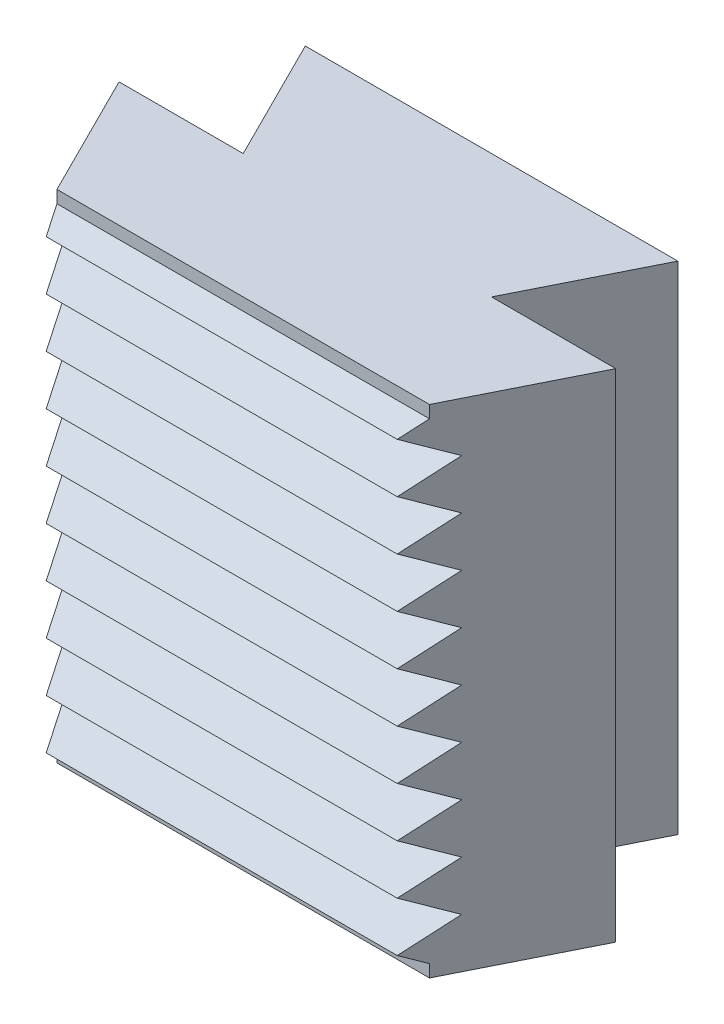
ISO-10303-21;
HEADER;
FILE_DESCRIPTION(('STEP AP214'),'2;1');
FILE_NAME('part.step','',(''),(''),'','','');
FILE_SCHEMA(('AUTOMOTIVE_DESIGN { 1 0 10303 214 1 1 1 1 }'));
ENDSEC;
DATA;
#1=APPLICATION_CONTEXT('core data for automotive mechanical design processes');
#2=APPLICATION_PROTOCOL_DEFINITION('international standard','automotive_design',2000,#1);
#3=PRODUCT_CONTEXT('',#1,'mechanical');
#4=PRODUCT('Part','Part','',(#3));
#5=PRODUCT_RELATED_PRODUCT_CATEGORY('part','',(#4));
#6=PRODUCT_DEFINITION_FORMATION('','',#4);
#7=PRODUCT_DEFINITION_CONTEXT('part definition',#1,'design');
#8=PRODUCT_DEFINITION('design','',#6,#7);
#9=PRODUCT_DEFINITION_SHAPE('','',#8);
#10=(LENGTH_UNIT() NAMED_UNIT(*) SI_UNIT(.MILLI.,.METRE.));
#11=(NAMED_UNIT(*) PLANE_ANGLE_UNIT() SI_UNIT($,.RADIAN.));
#12=(NAMED_UNIT(*) SI_UNIT($,.STERADIAN.) SOLID_ANGLE_UNIT());
#13=UNCERTAINTY_MEASURE_WITH_UNIT(LENGTH_MEASURE(1.E-05),#10,'distance_accuracy_value','');
#14=(GEOMETRIC_REPRESENTATION_CONTEXT(3) GLOBAL_UNCERTAINTY_ASSIGNED_CONTEXT((#13)) GLOBAL_UNIT_ASSIGNED_CONTEXT((#10,
#11,#12)) REPRESENTATION_CONTEXT('',''));
#15=CARTESIAN_POINT('',(0.,0.,0.));
#16=DIRECTION('',(0.,0.,1.));
#17=DIRECTION('',(1.,0.,0.));
#18=AXIS2_PLACEMENT_3D('',#15,#16,#17);
#19=CARTESIAN_POINT('',(-3.75,-5.,0.));
#20=DIRECTION('',(0.,0.,1.));
#21=DIRECTION('',(1.,0.,0.));
#22=AXIS2_PLACEMENT_3D('',#19,#20,#21);
#23=PLANE('',#22);
#24=DIRECTION('',(0.,1.,0.));
#25=VECTOR('',#24,1.);
#26=CARTESIAN_POINT('',(3.75,-5.,0.));
#27=LINE('',#26,#25);
#28=CARTESIAN_POINT('',(3.75,-5.,0.));
#29=VERTEX_POINT('',#28);
#30=CARTESIAN_POINT('',(3.75,-4.74999999999995,0.));
#31=VERTEX_POINT('',#30);
#32=EDGE_CURVE('E503',#29,#31,#27,.T.);
#33=ORIENTED_EDGE('',*,*,#32,.T.);
#34=DIRECTION('',(-1.,0.,0.));
#35=VECTOR('',#34,1.);
#36=CARTESIAN_POINT('',(-3.75,-4.74999999999995,0.));
#37=LINE('',#36,#35);
#38=CARTESIAN_POINT('',(-3.75,-4.74999999999995,0.));
#39=VERTEX_POINT('',#38);
#40=EDGE_CURVE('E276',#31,#39,#37,.T.);
#41=ORIENTED_EDGE('',*,*,#40,.T.);
#42=DIRECTION('',(0.,1.,0.));
#43=VECTOR('',#42,1.);
#44=CARTESIAN_POINT('',(-3.75,-5.,0.));
#45=LINE('',#44,#43);
#46=CARTESIAN_POINT('',(-3.75,-5.,0.));
#47=VERTEX_POINT('',#46);
#48=EDGE_CURVE('E507',#47,#39,#45,.T.);
#49=ORIENTED_EDGE('',*,*,#48,.F.);
#50=DIRECTION('',(1.,0.,0.));
#51=VECTOR('',#50,1.);
#52=CARTESIAN_POINT('',(-3.75,-5.,0.));
#53=LINE('',#52,#51);
#54=EDGE_CURVE('E457',#47,#29,#53,.T.);
#55=ORIENTED_EDGE('',*,*,#54,.T.);
#56=EDGE_LOOP('',(#33,#41,#49,#55));
#57=FACE_BOUND('',#56,.T.);
#58=ADVANCED_FACE('F41',(#57),#23,.T.);
#59=CARTESIAN_POINT('',(-3.75,4.75,0.));
#60=VERTEX_POINT('',#59);
#61=CARTESIAN_POINT('',(-3.75,5.,0.));
#62=VERTEX_POINT('',#61);
#63=EDGE_CURVE('E485',#60,#62,#45,.T.);
#64=ORIENTED_EDGE('',*,*,#63,.F.);
#65=DIRECTION('',(1.,0.,0.));
#66=VECTOR('',#65,1.);
#67=CARTESIAN_POINT('',(-3.75,4.75,0.));
#68=LINE('',#67,#66);
#69=CARTESIAN_POINT('',(3.75,4.75,0.));
#70=VERTEX_POINT('',#69);
#71=EDGE_CURVE('E11',#60,#70,#68,.T.);
#72=ORIENTED_EDGE('',*,*,#71,.T.);
#73=CARTESIAN_POINT('',(3.75,5.,0.));
#74=VERTEX_POINT('',#73);
#75=EDGE_CURVE('E506',#70,#74,#27,.T.);
#76=ORIENTED_EDGE('',*,*,#75,.T.);
#77=DIRECTION('',(1.,0.,0.));
#78=VECTOR('',#77,1.);
#79=CARTESIAN_POINT('',(-3.75,5.,0.));
#80=LINE('',#79,#78);
#81=EDGE_CURVE('E425',#62,#74,#80,.T.);
#82=ORIENTED_EDGE('',*,*,#81,.F.);
#83=EDGE_LOOP('',(#64,#72,#76,#82));
#84=FACE_BOUND('',#83,.T.);
#85=ADVANCED_FACE('F515',(#84),#23,.T.);
#86=CARTESIAN_POINT('',(-5.,-5.,-2.5));
#87=DIRECTION('',(-0.894427190999915,0.,0.447213595499959));
#88=DIRECTION('',(0.447213595499959,0.,0.894427190999915));
#89=AXIS2_PLACEMENT_3D('',#86,#87,#88);
#90=PLANE('',#89);
#91=DIRECTION('',(0.397359707119514,-0.458831467741123,0.794719414239026));
#92=VECTOR('',#91,1.);
#93=CARTESIAN_POINT('',(-3.9985159787279,4.03696153443295,-0.497031957455802));
#94=LINE('',#93,#92);
#95=CARTESIAN_POINT('',(-3.96650635094611,4.00000000000001,-0.433012701892223));
#96=VERTEX_POINT('',#95);
#97=CARTESIAN_POINT('',(-3.53349364905389,3.5,0.433012701892209));
#98=VERTEX_POINT('',#97);
#99=EDGE_CURVE('E384',#96,#98,#94,.T.);
#100=ORIENTED_EDGE('',*,*,#99,.F.);
#101=DIRECTION('',(-0.397359707119514,-0.458831467741124,-0.794719414239026));
#102=VECTOR('',#101,1.);
#103=CARTESIAN_POINT('',(-3.72503427226965,4.27882793925126,0.0499314554606941));
#104=LINE('',#103,#102);
#105=CARTESIAN_POINT('',(-3.53349364905389,4.5,0.43301270189222));
#106=VERTEX_POINT('',#105);
#107=EDGE_CURVE('E400',#106,#96,#104,.T.);
#108=ORIENTED_EDGE('',*,*,#107,.F.);
#109=DIRECTION('',(0.397359707119514,-0.458831467741123,0.794719414239026));
#110=VECTOR('',#109,1.);
#111=CARTESIAN_POINT('',(-3.9985159787279,5.03696153443295,-0.497031957455793));
#112=LINE('',#111,#110);
#113=EDGE_CURVE('E65',#60,#106,#112,.T.);
#114=ORIENTED_EDGE('',*,*,#113,.F.);
#115=ORIENTED_EDGE('',*,*,#63,.T.);
#116=DIRECTION('',(0.447213595499959,0.,0.894427190999915));
#117=VECTOR('',#116,1.);
#118=CARTESIAN_POINT('',(-5.,5.,-2.5));
#119=LINE('',#118,#117);
#120=CARTESIAN_POINT('',(-5.,5.,-2.5));
#121=VERTEX_POINT('',#120);
#122=EDGE_CURVE('E415',#121,#62,#119,.T.);
#123=ORIENTED_EDGE('',*,*,#122,.F.);
#124=DIRECTION('',(0.,1.,0.));
#125=VECTOR('',#124,1.);
#126=CARTESIAN_POINT('',(-5.,-5.,-2.5));
#127=LINE('',#126,#125);
#128=CARTESIAN_POINT('',(-5.,-5.,-2.5));
#129=VERTEX_POINT('',#128);
#130=EDGE_CURVE('E50',#129,#121,#127,.T.);
#131=ORIENTED_EDGE('',*,*,#130,.F.);
#132=DIRECTION('',(0.447213595499959,0.,0.894427190999915));
#133=VECTOR('',#132,1.);
#134=CARTESIAN_POINT('',(-5.,-5.,-2.5));
#135=LINE('',#134,#133);
#136=EDGE_CURVE('E453',#129,#47,#135,.T.);
#137=ORIENTED_EDGE('',*,*,#136,.T.);
#138=ORIENTED_EDGE('',*,*,#48,.T.);
#139=DIRECTION('',(-0.397359707119514,-0.458831467741124,-0.794719414239026));
#140=VECTOR('',#139,1.);
#141=CARTESIAN_POINT('',(-3.72503427226969,-4.72117206074873,0.0499314554606147));
#142=LINE('',#141,#140);
#143=CARTESIAN_POINT('',(-3.53349364905394,-4.5,0.433012701892126));
#144=VERTEX_POINT('',#143);
#145=EDGE_CURVE('E250',#144,#39,#142,.T.);
#146=ORIENTED_EDGE('',*,*,#145,.F.);
#147=DIRECTION('',(0.397359707119514,-0.458831467741123,0.794719414239026));
#148=VECTOR('',#147,1.);
#149=CARTESIAN_POINT('',(-3.99851597872794,-3.96303846556706,-0.497031957455872));
#150=LINE('',#149,#148);
#151=CARTESIAN_POINT('',(-3.96650635094615,-3.99999999999999,-0.433012701892308));
#152=VERTEX_POINT('',#151);
#153=EDGE_CURVE('E248',#152,#144,#150,.T.);
#154=ORIENTED_EDGE('',*,*,#153,.F.);
#155=DIRECTION('',(-0.397359707119514,-0.458831467741124,-0.794719414239026));
#156=VECTOR('',#155,1.);
#157=CARTESIAN_POINT('',(-3.72503427226969,-3.72117206074873,0.0499314554606236));
#158=LINE('',#157,#156);
#159=CARTESIAN_POINT('',(-3.53349364905393,-3.5,0.433012701892136));
#160=VERTEX_POINT('',#159);
#161=EDGE_CURVE('E235',#160,#152,#158,.T.);
#162=ORIENTED_EDGE('',*,*,#161,.F.);
#163=DIRECTION('',(0.397359707119514,-0.458831467741123,0.794719414239026));
#164=VECTOR('',#163,1.);
#165=CARTESIAN_POINT('',(-3.99851597872793,-2.96303846556706,-0.497031957455864));
#166=LINE('',#165,#164);
#167=CARTESIAN_POINT('',(-3.96650635094615,-2.99999999999999,-0.433012701892297));
#168=VERTEX_POINT('',#167);
#169=EDGE_CURVE('E245',#168,#160,#166,.T.);
#170=ORIENTED_EDGE('',*,*,#169,.F.);
#171=DIRECTION('',(-0.397359707119514,-0.458831467741124,-0.794719414239026));
#172=VECTOR('',#171,1.);
#173=CARTESIAN_POINT('',(-3.72503427226968,-2.72117206074873,0.0499314554606324));
#174=LINE('',#173,#172);
#175=CARTESIAN_POINT('',(-3.53349364905393,-2.5,0.433012701892146));
#176=VERTEX_POINT('',#175);
#177=EDGE_CURVE('E295',#176,#168,#174,.T.);
#178=ORIENTED_EDGE('',*,*,#177,.F.);
#179=DIRECTION('',(0.397359707119514,-0.458831467741123,0.794719414239026));
#180=VECTOR('',#179,1.);
#181=CARTESIAN_POINT('',(-3.99851597872793,-1.96303846556706,-0.497031957455855));
#182=LINE('',#181,#180);
#183=CARTESIAN_POINT('',(-3.96650635094614,-1.99999999999999,-0.433012701892287));
#184=VERTEX_POINT('',#183);
#185=EDGE_CURVE('E289',#184,#176,#182,.T.);
#186=ORIENTED_EDGE('',*,*,#185,.F.);
#187=DIRECTION('',(-0.397359707119514,-0.458831467741124,-0.794719414239026));
#188=VECTOR('',#187,1.);
#189=CARTESIAN_POINT('',(-3.72503427226968,-1.72117206074873,0.0499314554606412));
#190=LINE('',#189,#188);
#191=CARTESIAN_POINT('',(-3.53349364905392,-1.5,0.433012701892157));
#192=VERTEX_POINT('',#191);
#193=EDGE_CURVE('E311',#192,#184,#190,.T.);
#194=ORIENTED_EDGE('',*,*,#193,.F.);
#195=DIRECTION('',(0.397359707119514,-0.458831467741123,0.794719414239026));
#196=VECTOR('',#195,1.);
#197=CARTESIAN_POINT('',(-3.99851597872792,-0.963038465567057,-0.497031957455846));
#198=LINE('',#197,#196);
#199=CARTESIAN_POINT('',(-3.96650635094614,-0.999999999999991,-0.433012701892276));
#200=VERTEX_POINT('',#199);
#201=EDGE_CURVE('E304',#200,#192,#198,.T.);
#202=ORIENTED_EDGE('',*,*,#201,.F.);
#203=DIRECTION('',(-0.397359707119514,-0.458831467741124,-0.794719414239026));
#204=VECTOR('',#203,1.);
#205=CARTESIAN_POINT('',(-3.72503427226968,-0.721172060748734,0.0499314554606501));
#206=LINE('',#205,#204);
#207=CARTESIAN_POINT('',(-3.53349364905392,-0.5,0.433012701892168));
#208=VERTEX_POINT('',#207);
#209=EDGE_CURVE('E327',#208,#200,#206,.T.);
#210=ORIENTED_EDGE('',*,*,#209,.F.);
#211=DIRECTION('',(0.397359707119514,-0.458831467741123,0.794719414239026));
#212=VECTOR('',#211,1.);
#213=CARTESIAN_POINT('',(-3.99851597872792,0.0369615344329442,-0.497031957455837));
#214=LINE('',#213,#212);
#215=CARTESIAN_POINT('',(-3.96650635094613,0.,-0.433012701892266));
#216=VERTEX_POINT('',#215);
#217=EDGE_CURVE('E320',#216,#208,#214,.T.);
#218=ORIENTED_EDGE('',*,*,#217,.F.);
#219=DIRECTION('',(-0.397359707119514,-0.458831467741124,-0.794719414239026));
#220=VECTOR('',#219,1.);
#221=CARTESIAN_POINT('',(-3.72503427226967,0.278827939251265,0.0499314554606588));
#222=LINE('',#221,#220);
#223=CARTESIAN_POINT('',(-3.53349364905391,0.5,0.433012701892178));
#224=VERTEX_POINT('',#223);
#225=EDGE_CURVE('E343',#224,#216,#222,.T.);
#226=ORIENTED_EDGE('',*,*,#225,.F.);
#227=DIRECTION('',(0.397359707119514,-0.458831467741123,0.794719414239026));
#228=VECTOR('',#227,1.);
#229=CARTESIAN_POINT('',(-3.99851597872791,1.03696153443295,-0.497031957455828));
#230=LINE('',#229,#228);
#231=CARTESIAN_POINT('',(-3.96650635094613,1.00000000000001,-0.433012701892255));
#232=VERTEX_POINT('',#231);
#233=EDGE_CURVE('E336',#232,#224,#230,.T.);
#234=ORIENTED_EDGE('',*,*,#233,.F.);
#235=DIRECTION('',(-0.397359707119514,-0.458831467741124,-0.794719414239026));
#236=VECTOR('',#235,1.);
#237=CARTESIAN_POINT('',(-3.72503427226967,1.27882793925126,0.0499314554606676));
#238=LINE('',#237,#236);
#239=CARTESIAN_POINT('',(-3.53349364905391,1.5,0.433012701892188));
#240=VERTEX_POINT('',#239);
#241=EDGE_CURVE('E359',#240,#232,#238,.T.);
#242=ORIENTED_EDGE('',*,*,#241,.F.);
#243=DIRECTION('',(0.397359707119514,-0.458831467741123,0.794719414239026));
#244=VECTOR('',#243,1.);
#245=CARTESIAN_POINT('',(-3.99851597872791,2.03696153443295,-0.497031957455819));
#246=LINE('',#245,#244);
#247=CARTESIAN_POINT('',(-3.96650635094612,2.00000000000001,-0.433012701892245));
#248=VERTEX_POINT('',#247);
#249=EDGE_CURVE('E352',#248,#240,#246,.T.);
#250=ORIENTED_EDGE('',*,*,#249,.F.);
#251=DIRECTION('',(-0.397359707119514,-0.458831467741124,-0.794719414239026));
#252=VECTOR('',#251,1.);
#253=CARTESIAN_POINT('',(-3.72503427226966,2.27882793925126,0.0499314554606764));
#254=LINE('',#253,#252);
#255=CARTESIAN_POINT('',(-3.5334936490539,2.5,0.433012701892199));
#256=VERTEX_POINT('',#255);
#257=EDGE_CURVE('E375',#256,#248,#254,.T.);
#258=ORIENTED_EDGE('',*,*,#257,.F.);
#259=DIRECTION('',(0.397359707119514,-0.458831467741123,0.794719414239026));
#260=VECTOR('',#259,1.);
#261=CARTESIAN_POINT('',(-3.99851597872791,3.03696153443295,-0.497031957455811));
#262=LINE('',#261,#260);
#263=CARTESIAN_POINT('',(-3.96650635094612,3.00000000000001,-0.433012701892234));
#264=VERTEX_POINT('',#263);
#265=EDGE_CURVE('E368',#264,#256,#262,.T.);
#266=ORIENTED_EDGE('',*,*,#265,.F.);
#267=DIRECTION('',(-0.397359707119514,-0.458831467741124,-0.794719414239026));
#268=VECTOR('',#267,1.);
#269=CARTESIAN_POINT('',(-3.72503427226966,3.27882793925126,0.0499314554606854));
#270=LINE('',#269,#268);
#271=EDGE_CURVE('E391',#98,#264,#270,.T.);
#272=ORIENTED_EDGE('',*,*,#271,.F.);
#273=EDGE_LOOP('',(#100,#108,#114,#115,#123,#131,#137,#138,#146,#154,#162,#170,#178,#186,#194,
#202,#210,#218,#226,#234,#242,#250,#258,#266,#272));
#274=FACE_BOUND('',#273,.T.);
#275=ADVANCED_FACE('F43',(#274),#90,.T.);
#276=CARTESIAN_POINT('',(-5.,-5.,-2.5));
#277=DIRECTION('',(0.,0.,-1.));
#278=DIRECTION('',(-1.,0.,0.));
#279=AXIS2_PLACEMENT_3D('',#276,#277,#278);
#280=PLANE('',#279);
#281=ORIENTED_EDGE('',*,*,#130,.T.);
#282=DIRECTION('',(-1.,0.,0.));
#283=VECTOR('',#282,1.);
#284=CARTESIAN_POINT('',(-5.,5.,-2.5));
#285=LINE('',#284,#283);
#286=CARTESIAN_POINT('',(-2.5,5.,-2.5));
#287=VERTEX_POINT('',#286);
#288=EDGE_CURVE('E449',#287,#121,#285,.T.);
#289=ORIENTED_EDGE('',*,*,#288,.F.);
#290=DIRECTION('',(0.,1.,0.));
#291=VECTOR('',#290,1.);
#292=CARTESIAN_POINT('',(-2.5,-5.,-2.5));
#293=LINE('',#292,#291);
#294=CARTESIAN_POINT('',(-2.5,-5.,-2.5));
#295=VERTEX_POINT('',#294);
#296=EDGE_CURVE('E488',#295,#287,#293,.T.);
#297=ORIENTED_EDGE('',*,*,#296,.F.);
#298=DIRECTION('',(-1.,0.,0.));
#299=VECTOR('',#298,1.);
#300=CARTESIAN_POINT('',(-5.,-5.,-2.5));
#301=LINE('',#300,#299);
#302=EDGE_CURVE('E481',#295,#129,#301,.T.);
#303=ORIENTED_EDGE('',*,*,#302,.T.);
#304=EDGE_LOOP('',(#281,#289,#297,#303));
#305=FACE_BOUND('',#304,.T.);
#306=ADVANCED_FACE('F523',(#305),#280,.T.);
#307=CARTESIAN_POINT('',(-2.5,-5.,-2.5));
#308=DIRECTION('',(-0.894427190999917,0.,0.447213595499957));
#309=DIRECTION('',(0.447213595499957,0.,0.894427190999917));
#310=AXIS2_PLACEMENT_3D('',#307,#308,#309);
#311=PLANE('',#310);
#312=ORIENTED_EDGE('',*,*,#296,.T.);
#313=DIRECTION('',(0.447213595499957,0.,0.894427190999917));
#314=VECTOR('',#313,1.);
#315=CARTESIAN_POINT('',(-2.5,5.,-2.5));
#316=LINE('',#315,#314);
#317=CARTESIAN_POINT('',(-3.75,5.,-5.));
#318=VERTEX_POINT('',#317);
#319=EDGE_CURVE('E445',#318,#287,#316,.T.);
#320=ORIENTED_EDGE('',*,*,#319,.F.);
#321=DIRECTION('',(0.,1.,0.));
#322=VECTOR('',#321,1.);
#323=CARTESIAN_POINT('',(-3.75,-5.,-5.));
#324=LINE('',#323,#322);
#325=CARTESIAN_POINT('',(-3.75,-5.,-5.));
#326=VERTEX_POINT('',#325);
#327=EDGE_CURVE('E491',#326,#318,#324,.T.);
#328=ORIENTED_EDGE('',*,*,#327,.F.);
#329=DIRECTION('',(0.447213595499957,0.,0.894427190999917));
#330=VECTOR('',#329,1.);
#331=CARTESIAN_POINT('',(-2.5,-5.,-2.5));
#332=LINE('',#331,#330);
#333=EDGE_CURVE('E477',#326,#295,#332,.T.);
#334=ORIENTED_EDGE('',*,*,#333,.T.);
#335=EDGE_LOOP('',(#312,#320,#328,#334));
#336=FACE_BOUND('',#335,.T.);
#337=ADVANCED_FACE('F627',(#336),#311,.T.);
#338=CARTESIAN_POINT('',(-3.75,-5.,-5.));
#339=DIRECTION('',(0.,0.,-1.));
#340=DIRECTION('',(-1.,0.,0.));
#341=AXIS2_PLACEMENT_3D('',#338,#339,#340);
#342=PLANE('',#341);
#343=ORIENTED_EDGE('',*,*,#327,.T.);
#344=DIRECTION('',(-1.,0.,0.));
#345=VECTOR('',#344,1.);
#346=CARTESIAN_POINT('',(-3.75,5.,-5.));
#347=LINE('',#346,#345);
#348=CARTESIAN_POINT('',(3.75,5.,-5.));
#349=VERTEX_POINT('',#348);
#350=EDGE_CURVE('E441',#349,#318,#347,.T.);
#351=ORIENTED_EDGE('',*,*,#350,.F.);
#352=DIRECTION('',(0.,1.,0.));
#353=VECTOR('',#352,1.);
#354=CARTESIAN_POINT('',(3.75,-5.,-5.));
#355=LINE('',#354,#353);
#356=CARTESIAN_POINT('',(3.75,-5.,-5.));
#357=VERTEX_POINT('',#356);
#358=EDGE_CURVE('E494',#357,#349,#355,.T.);
#359=ORIENTED_EDGE('',*,*,#358,.F.);
#360=DIRECTION('',(-1.,0.,0.));
#361=VECTOR('',#360,1.);
#362=CARTESIAN_POINT('',(-3.75,-5.,-5.));
#363=LINE('',#362,#361);
#364=EDGE_CURVE('E473',#357,#326,#363,.T.);
#365=ORIENTED_EDGE('',*,*,#364,.T.);
#366=EDGE_LOOP('',(#343,#351,#359,#365));
#367=FACE_BOUND('',#366,.T.);
#368=ADVANCED_FACE('F623',(#367),#342,.T.);
#369=CARTESIAN_POINT('',(3.75,-5.,-5.));
#370=DIRECTION('',(0.894427190999916,0.,0.447213595499958));
#371=DIRECTION('',(0.447213595499958,0.,-0.894427190999916));
#372=AXIS2_PLACEMENT_3D('',#369,#370,#371);
#373=PLANE('',#372);
#374=ORIENTED_EDGE('',*,*,#358,.T.);
#375=DIRECTION('',(0.447213595499958,0.,-0.894427190999916));
#376=VECTOR('',#375,1.);
#377=CARTESIAN_POINT('',(3.75,5.,-5.));
#378=LINE('',#377,#376);
#379=CARTESIAN_POINT('',(2.5,5.,-2.5));
#380=VERTEX_POINT('',#379);
#381=EDGE_CURVE('E437',#380,#349,#378,.T.);
#382=ORIENTED_EDGE('',*,*,#381,.F.);
#383=DIRECTION('',(0.,1.,0.));
#384=VECTOR('',#383,1.);
#385=CARTESIAN_POINT('',(2.5,-5.,-2.5));
#386=LINE('',#385,#384);
#387=CARTESIAN_POINT('',(2.5,-5.,-2.5));
#388=VERTEX_POINT('',#387);
#389=EDGE_CURVE('E497',#388,#380,#386,.T.);
#390=ORIENTED_EDGE('',*,*,#389,.F.);
#391=DIRECTION('',(0.447213595499958,0.,-0.894427190999916));
#392=VECTOR('',#391,1.);
#393=CARTESIAN_POINT('',(3.75,-5.,-5.));
#394=LINE('',#393,#392);
#395=EDGE_CURVE('E469',#388,#357,#394,.T.);
#396=ORIENTED_EDGE('',*,*,#395,.T.);
#397=EDGE_LOOP('',(#374,#382,#390,#396));
#398=FACE_BOUND('',#397,.T.);
#399=ADVANCED_FACE('F619',(#398),#373,.T.);
#400=CARTESIAN_POINT('',(2.5,-5.,-2.5));
#401=DIRECTION('',(0.,0.,-1.));
#402=DIRECTION('',(-1.,0.,0.));
#403=AXIS2_PLACEMENT_3D('',#400,#401,#402);
#404=PLANE('',#403);
#405=ORIENTED_EDGE('',*,*,#389,.T.);
#406=DIRECTION('',(-1.,0.,0.));
#407=VECTOR('',#406,1.);
#408=CARTESIAN_POINT('',(2.5,5.,-2.5));
#409=LINE('',#408,#407);
#410=CARTESIAN_POINT('',(5.,5.,-2.5));
#411=VERTEX_POINT('',#410);
#412=EDGE_CURVE('E433',#411,#380,#409,.T.);
#413=ORIENTED_EDGE('',*,*,#412,.F.);
#414=DIRECTION('',(0.,1.,0.));
#415=VECTOR('',#414,1.);
#416=CARTESIAN_POINT('',(5.,-5.,-2.5));
#417=LINE('',#416,#415);
#418=CARTESIAN_POINT('',(5.,-5.,-2.5));
#419=VERTEX_POINT('',#418);
#420=EDGE_CURVE('E500',#419,#411,#417,.T.);
#421=ORIENTED_EDGE('',*,*,#420,.F.);
#422=DIRECTION('',(-1.,0.,0.));
#423=VECTOR('',#422,1.);
#424=CARTESIAN_POINT('',(2.5,-5.,-2.5));
#425=LINE('',#424,#423);
#426=EDGE_CURVE('E465',#419,#388,#425,.T.);
#427=ORIENTED_EDGE('',*,*,#426,.T.);
#428=EDGE_LOOP('',(#405,#413,#421,#427));
#429=FACE_BOUND('',#428,.T.);
#430=ADVANCED_FACE('F616',(#429),#404,.T.);
#431=CARTESIAN_POINT('',(3.75,-5.,0.));
#432=DIRECTION('',(0.894427190999916,0.,0.447213595499958));
#433=DIRECTION('',(0.447213595499958,0.,-0.894427190999916));
#434=AXIS2_PLACEMENT_3D('',#431,#432,#433);
#435=PLANE('',#434);
#436=DIRECTION('',(0.397359707119513,-0.458831467741124,-0.794719414239026));
#437=VECTOR('',#436,1.);
#438=CARTESIAN_POINT('',(3.72503427226965,4.27882793925126,0.0499314554606951));
#439=LINE('',#438,#437);
#440=CARTESIAN_POINT('',(3.53349364905389,4.5,0.43301270189222));
#441=VERTEX_POINT('',#440);
#442=CARTESIAN_POINT('',(3.96650635094611,4.00000000000001,-0.433012701892224));
#443=VERTEX_POINT('',#442);
#444=EDGE_CURVE('E412',#441,#443,#439,.T.);
#445=ORIENTED_EDGE('',*,*,#444,.T.);
#446=DIRECTION('',(-0.397359707119513,-0.458831467741123,0.794719414239026));
#447=VECTOR('',#446,1.);
#448=CARTESIAN_POINT('',(3.9985159787279,4.03696153443295,-0.497031957455801));
#449=LINE('',#448,#447);
#450=CARTESIAN_POINT('',(3.53349364905389,3.5,0.433012701892209));
#451=VERTEX_POINT('',#450);
#452=EDGE_CURVE('E57',#443,#451,#449,.T.);
#453=ORIENTED_EDGE('',*,*,#452,.T.);
#454=DIRECTION('',(0.397359707119513,-0.458831467741124,-0.794719414239026));
#455=VECTOR('',#454,1.);
#456=CARTESIAN_POINT('',(3.72503427226966,3.27882793925126,0.0499314554606862));
#457=LINE('',#456,#455);
#458=CARTESIAN_POINT('',(3.96650635094612,3.00000000000001,-0.433012701892234));
#459=VERTEX_POINT('',#458);
#460=EDGE_CURVE('E397',#451,#459,#457,.T.);
#461=ORIENTED_EDGE('',*,*,#460,.T.);
#462=DIRECTION('',(-0.397359707119513,-0.458831467741123,0.794719414239026));
#463=VECTOR('',#462,1.);
#464=CARTESIAN_POINT('',(3.9985159787279,3.03696153443295,-0.49703195745581));
#465=LINE('',#464,#463);
#466=CARTESIAN_POINT('',(3.5334936490539,2.5,0.433012701892199));
#467=VERTEX_POINT('',#466);
#468=EDGE_CURVE('E385',#459,#467,#465,.T.);
#469=ORIENTED_EDGE('',*,*,#468,.T.);
#470=DIRECTION('',(0.397359707119513,-0.458831467741124,-0.794719414239026));
#471=VECTOR('',#470,1.);
#472=CARTESIAN_POINT('',(3.72503427226966,2.27882793925126,0.0499314554606773));
#473=LINE('',#472,#471);
#474=CARTESIAN_POINT('',(3.96650635094612,2.00000000000001,-0.433012701892245));
#475=VERTEX_POINT('',#474);
#476=EDGE_CURVE('E381',#467,#475,#473,.T.);
#477=ORIENTED_EDGE('',*,*,#476,.T.);
#478=DIRECTION('',(-0.397359707119513,-0.458831467741123,0.794719414239026));
#479=VECTOR('',#478,1.);
#480=CARTESIAN_POINT('',(3.99851597872791,2.03696153443295,-0.497031957455819));
#481=LINE('',#480,#479);
#482=CARTESIAN_POINT('',(3.5334936490539,1.5,0.433012701892188));
#483=VERTEX_POINT('',#482);
#484=EDGE_CURVE('E369',#475,#483,#481,.T.);
#485=ORIENTED_EDGE('',*,*,#484,.T.);
#486=DIRECTION('',(0.397359707119513,-0.458831467741124,-0.794719414239026));
#487=VECTOR('',#486,1.);
#488=CARTESIAN_POINT('',(3.72503427226966,1.27882793925126,0.0499314554606686));
#489=LINE('',#488,#487);
#490=CARTESIAN_POINT('',(3.96650635094613,1.00000000000001,-0.433012701892256));
#491=VERTEX_POINT('',#490);
#492=EDGE_CURVE('E365',#483,#491,#489,.T.);
#493=ORIENTED_EDGE('',*,*,#492,.T.);
#494=DIRECTION('',(-0.397359707119513,-0.458831467741123,0.794719414239026));
#495=VECTOR('',#494,1.);
#496=CARTESIAN_POINT('',(3.99851597872791,1.03696153443294,-0.497031957455828));
#497=LINE('',#496,#495);
#498=CARTESIAN_POINT('',(3.53349364905391,0.5,0.433012701892178));
#499=VERTEX_POINT('',#498);
#500=EDGE_CURVE('E353',#491,#499,#497,.T.);
#501=ORIENTED_EDGE('',*,*,#500,.T.);
#502=DIRECTION('',(0.397359707119513,-0.458831467741124,-0.794719414239026));
#503=VECTOR('',#502,1.);
#504=CARTESIAN_POINT('',(3.72503427226967,0.278827939251266,0.0499314554606598));
#505=LINE('',#504,#503);
#506=CARTESIAN_POINT('',(3.96650635094613,0.,-0.433012701892266));
#507=VERTEX_POINT('',#506);
#508=EDGE_CURVE('E349',#499,#507,#505,.T.);
#509=ORIENTED_EDGE('',*,*,#508,.T.);
#510=DIRECTION('',(-0.397359707119513,-0.458831467741123,0.794719414239026));
#511=VECTOR('',#510,1.);
#512=CARTESIAN_POINT('',(3.99851597872792,0.0369615344329438,-0.497031957455837));
#513=LINE('',#512,#511);
#514=CARTESIAN_POINT('',(3.53349364905392,-0.5,0.433012701892167));
#515=VERTEX_POINT('',#514);
#516=EDGE_CURVE('E337',#507,#515,#513,.T.);
#517=ORIENTED_EDGE('',*,*,#516,.T.);
#518=DIRECTION('',(0.397359707119513,-0.458831467741124,-0.794719414239026));
#519=VECTOR('',#518,1.);
#520=CARTESIAN_POINT('',(3.72503427226967,-0.721172060748733,0.0499314554606509));
#521=LINE('',#520,#519);
#522=CARTESIAN_POINT('',(3.96650635094614,-0.999999999999991,-0.433012701892277));
#523=VERTEX_POINT('',#522);
#524=EDGE_CURVE('E333',#515,#523,#521,.T.);
#525=ORIENTED_EDGE('',*,*,#524,.T.);
#526=DIRECTION('',(-0.397359707119513,-0.458831467741123,0.794719414239026));
#527=VECTOR('',#526,1.);
#528=CARTESIAN_POINT('',(3.99851597872792,-0.963038465567057,-0.497031957455845));
#529=LINE('',#528,#527);
#530=CARTESIAN_POINT('',(3.53349364905392,-1.5,0.433012701892157));
#531=VERTEX_POINT('',#530);
#532=EDGE_CURVE('E321',#523,#531,#529,.T.);
#533=ORIENTED_EDGE('',*,*,#532,.T.);
#534=DIRECTION('',(0.397359707119513,-0.458831467741124,-0.794719414239026));
#535=VECTOR('',#534,1.);
#536=CARTESIAN_POINT('',(3.72503427226968,-1.72117206074873,0.0499314554606421));
#537=LINE('',#536,#535);
#538=CARTESIAN_POINT('',(3.96650635094614,-1.99999999999999,-0.433012701892287));
#539=VERTEX_POINT('',#538);
#540=EDGE_CURVE('E317',#531,#539,#537,.T.);
#541=ORIENTED_EDGE('',*,*,#540,.T.);
#542=DIRECTION('',(-0.397359707119513,-0.458831467741123,0.794719414239026));
#543=VECTOR('',#542,1.);
#544=CARTESIAN_POINT('',(3.99851597872793,-1.96303846556706,-0.497031957455854));
#545=LINE('',#544,#543);
#546=CARTESIAN_POINT('',(3.53349364905393,-2.5,0.433012701892146));
#547=VERTEX_POINT('',#546);
#548=EDGE_CURVE('E305',#539,#547,#545,.T.);
#549=ORIENTED_EDGE('',*,*,#548,.T.);
#550=DIRECTION('',(0.397359707119513,-0.458831467741124,-0.794719414239026));
#551=VECTOR('',#550,1.);
#552=CARTESIAN_POINT('',(3.72503427226968,-2.72117206074873,0.0499314554606333));
#553=LINE('',#552,#551);
#554=CARTESIAN_POINT('',(3.96650635094615,-2.99999999999999,-0.433012701892297));
#555=VERTEX_POINT('',#554);
#556=EDGE_CURVE('E301',#547,#555,#553,.T.);
#557=ORIENTED_EDGE('',*,*,#556,.T.);
#558=DIRECTION('',(-0.397359707119513,-0.458831467741123,0.794719414239026));
#559=VECTOR('',#558,1.);
#560=CARTESIAN_POINT('',(3.99851597872793,-2.96303846556706,-0.497031957455863));
#561=LINE('',#560,#559);
#562=CARTESIAN_POINT('',(3.53349364905393,-3.5,0.433012701892136));
#563=VERTEX_POINT('',#562);
#564=EDGE_CURVE('E290',#555,#563,#561,.T.);
#565=ORIENTED_EDGE('',*,*,#564,.T.);
#566=DIRECTION('',(0.397359707119513,-0.458831467741124,-0.794719414239026));
#567=VECTOR('',#566,1.);
#568=CARTESIAN_POINT('',(3.72503427226969,-3.72117206074873,0.0499314554606245));
#569=LINE('',#568,#567);
#570=CARTESIAN_POINT('',(3.96650635094615,-3.99999999999999,-0.433012701892308));
#571=VERTEX_POINT('',#570);
#572=EDGE_CURVE('E286',#563,#571,#569,.T.);
#573=ORIENTED_EDGE('',*,*,#572,.T.);
#574=DIRECTION('',(-0.397359707119513,-0.458831467741123,0.794719414239026));
#575=VECTOR('',#574,1.);
#576=CARTESIAN_POINT('',(3.99851597872793,-3.96303846556706,-0.497031957455872));
#577=LINE('',#576,#575);
#578=CARTESIAN_POINT('',(3.53349364905394,-4.5,0.433012701892125));
#579=VERTEX_POINT('',#578);
#580=EDGE_CURVE('E259',#571,#579,#577,.T.);
#581=ORIENTED_EDGE('',*,*,#580,.T.);
#582=DIRECTION('',(0.397359707119513,-0.458831467741124,-0.794719414239026));
#583=VECTOR('',#582,1.);
#584=CARTESIAN_POINT('',(3.72503427226969,-4.72117206074873,0.0499314554606157));
#585=LINE('',#584,#583);
#586=EDGE_CURVE('E272',#579,#31,#585,.T.);
#587=ORIENTED_EDGE('',*,*,#586,.T.);
#588=ORIENTED_EDGE('',*,*,#32,.F.);
#589=DIRECTION('',(0.447213595499958,0.,-0.894427190999916));
#590=VECTOR('',#589,1.);
#591=CARTESIAN_POINT('',(3.75,-5.,0.));
#592=LINE('',#591,#590);
#593=EDGE_CURVE('E461',#29,#419,#592,.T.);
#594=ORIENTED_EDGE('',*,*,#593,.T.);
#595=ORIENTED_EDGE('',*,*,#420,.T.);
#596=DIRECTION('',(0.447213595499958,0.,-0.894427190999916));
#597=VECTOR('',#596,1.);
#598=CARTESIAN_POINT('',(3.75,5.,0.));
#599=LINE('',#598,#597);
#600=EDGE_CURVE('E429',#74,#411,#599,.T.);
#601=ORIENTED_EDGE('',*,*,#600,.F.);
#602=ORIENTED_EDGE('',*,*,#75,.F.);
#603=DIRECTION('',(-0.397359707119513,-0.458831467741123,0.794719414239026));
#604=VECTOR('',#603,1.);
#605=CARTESIAN_POINT('',(3.9985159787279,5.03696153443295,-0.497031957455792));
#606=LINE('',#605,#604);
#607=EDGE_CURVE('E416',#70,#441,#606,.T.);
#608=ORIENTED_EDGE('',*,*,#607,.T.);
#609=EDGE_LOOP('',(#445,#453,#461,#469,#477,#485,#493,#501,#509,#517,#525,#533,#541,#549,#557,
#565,#573,#581,#587,#588,#594,#595,#601,#602,#608));
#610=FACE_BOUND('',#609,.T.);
#611=ADVANCED_FACE('F537',(#610),#435,.T.);
#612=CARTESIAN_POINT('',(0.,-5.,0.));
#613=DIRECTION('',(0.,1.,0.));
#614=DIRECTION('',(0.,0.,1.));
#615=AXIS2_PLACEMENT_3D('',#612,#613,#614);
#616=PLANE('',#615);
#617=ORIENTED_EDGE('',*,*,#136,.F.);
#618=ORIENTED_EDGE('',*,*,#302,.F.);
#619=ORIENTED_EDGE('',*,*,#333,.F.);
#620=ORIENTED_EDGE('',*,*,#364,.F.);
#621=ORIENTED_EDGE('',*,*,#395,.F.);
#622=ORIENTED_EDGE('',*,*,#426,.F.);
#623=ORIENTED_EDGE('',*,*,#593,.F.);
#624=ORIENTED_EDGE('',*,*,#54,.F.);
#625=EDGE_LOOP('',(#617,#618,#619,#620,#621,#622,#623,#624));
#626=FACE_BOUND('',#625,.T.);
#627=ADVANCED_FACE('F528',(#626),#616,.F.);
#628=CARTESIAN_POINT('',(0.,5.,0.));
#629=DIRECTION('',(0.,1.,0.));
#630=DIRECTION('',(0.,0.,1.));
#631=AXIS2_PLACEMENT_3D('',#628,#629,#630);
#632=PLANE('',#631);
#633=ORIENTED_EDGE('',*,*,#122,.T.);
#634=ORIENTED_EDGE('',*,*,#81,.T.);
#635=ORIENTED_EDGE('',*,*,#600,.T.);
#636=ORIENTED_EDGE('',*,*,#412,.T.);
#637=ORIENTED_EDGE('',*,*,#381,.T.);
#638=ORIENTED_EDGE('',*,*,#350,.T.);
#639=ORIENTED_EDGE('',*,*,#319,.T.);
#640=ORIENTED_EDGE('',*,*,#288,.T.);
#641=EDGE_LOOP('',(#633,#634,#635,#636,#637,#638,#639,#640));
#642=FACE_BOUND('',#641,.T.);
#643=ADVANCED_FACE('F519',(#642),#632,.T.);
#644=CARTESIAN_POINT('',(4.74658426275372,4.875,-0.216506350946109));
#645=DIRECTION('',(0.,-0.866025403784439,-0.5));
#646=DIRECTION('',(0.,0.5,-0.866025403784439));
#647=AXIS2_PLACEMENT_3D('',#644,#645,#646);
#648=PLANE('',#647);
#649=ORIENTED_EDGE('',*,*,#71,.F.);
#650=ORIENTED_EDGE('',*,*,#113,.T.);
#651=DIRECTION('',(-1.,0.,0.));
#652=VECTOR('',#651,1.);
#653=CARTESIAN_POINT('',(4.74658426275372,4.5,0.43301270189222));
#654=LINE('',#653,#652);
#655=EDGE_CURVE('E411',#441,#106,#654,.T.);
#656=ORIENTED_EDGE('',*,*,#655,.F.);
#657=ORIENTED_EDGE('',*,*,#607,.F.);
#658=EDGE_LOOP('',(#649,#650,#656,#657));
#659=FACE_BOUND('',#658,.T.);
#660=ADVANCED_FACE('F600',(#659),#648,.F.);
#661=CARTESIAN_POINT('',(4.74658426275372,4.5,0.43301270189222));
#662=DIRECTION('',(0.,0.866025403784438,-0.500000000000001));
#663=DIRECTION('',(0.,0.500000000000001,0.866025403784438));
#664=AXIS2_PLACEMENT_3D('',#661,#662,#663);
#665=PLANE('',#664);
#666=ORIENTED_EDGE('',*,*,#107,.T.);
#667=DIRECTION('',(1.,0.,0.));
#668=VECTOR('',#667,1.);
#669=CARTESIAN_POINT('',(-5.,4.00000000000001,-0.433012701892224));
#670=LINE('',#669,#668);
#671=EDGE_CURVE('E255',#96,#443,#670,.T.);
#672=ORIENTED_EDGE('',*,*,#671,.T.);
#673=ORIENTED_EDGE('',*,*,#444,.F.);
#674=ORIENTED_EDGE('',*,*,#655,.T.);
#675=EDGE_LOOP('',(#666,#672,#673,#674));
#676=FACE_BOUND('',#675,.T.);
#677=ADVANCED_FACE('F582',(#676),#665,.F.);
#678=CARTESIAN_POINT('',(4.74658426275372,3.5,0.433012701892209));
#679=DIRECTION('',(0.,0.866025403784438,-0.500000000000001));
#680=DIRECTION('',(0.,0.500000000000001,0.866025403784438));
#681=AXIS2_PLACEMENT_3D('',#678,#679,#680);
#682=PLANE('',#681);
#683=ORIENTED_EDGE('',*,*,#271,.T.);
#684=DIRECTION('',(1.,0.,0.));
#685=VECTOR('',#684,1.);
#686=CARTESIAN_POINT('',(-5.,3.00000000000001,-0.433012701892234));
#687=LINE('',#686,#685);
#688=EDGE_CURVE('E574',#264,#459,#687,.T.);
#689=ORIENTED_EDGE('',*,*,#688,.T.);
#690=ORIENTED_EDGE('',*,*,#460,.F.);
#691=DIRECTION('',(-1.,0.,0.));
#692=VECTOR('',#691,1.);
#693=CARTESIAN_POINT('',(4.74658426275372,3.5,0.433012701892209));
#694=LINE('',#693,#692);
#695=EDGE_CURVE('E394',#451,#98,#694,.T.);
#696=ORIENTED_EDGE('',*,*,#695,.T.);
#697=EDGE_LOOP('',(#683,#689,#690,#696));
#698=FACE_BOUND('',#697,.T.);
#699=ADVANCED_FACE('F588',(#698),#682,.F.);
#700=CARTESIAN_POINT('',(4.74658426275372,3.875,-0.216506350946119));
#701=DIRECTION('',(0.,-0.866025403784439,-0.5));
#702=DIRECTION('',(0.,0.5,-0.866025403784439));
#703=AXIS2_PLACEMENT_3D('',#700,#701,#702);
#704=PLANE('',#703);
#705=ORIENTED_EDGE('',*,*,#695,.F.);
#706=ORIENTED_EDGE('',*,*,#452,.F.);
#707=ORIENTED_EDGE('',*,*,#671,.F.);
#708=ORIENTED_EDGE('',*,*,#99,.T.);
#709=EDGE_LOOP('',(#705,#706,#707,#708));
#710=FACE_BOUND('',#709,.T.);
#711=ADVANCED_FACE('F584',(#710),#704,.F.);
#712=CARTESIAN_POINT('',(4.74658426275372,2.5,0.433012701892199));
#713=DIRECTION('',(0.,0.866025403784438,-0.5));
#714=DIRECTION('',(0.,0.500000000000001,0.866025403784438));
#715=AXIS2_PLACEMENT_3D('',#712,#713,#714);
#716=PLANE('',#715);
#717=ORIENTED_EDGE('',*,*,#257,.T.);
#718=DIRECTION('',(1.,0.,0.));
#719=VECTOR('',#718,1.);
#720=CARTESIAN_POINT('',(-5.,2.00000000000001,-0.433012701892245));
#721=LINE('',#720,#719);
#722=EDGE_CURVE('E570',#248,#475,#721,.T.);
#723=ORIENTED_EDGE('',*,*,#722,.T.);
#724=ORIENTED_EDGE('',*,*,#476,.F.);
#725=DIRECTION('',(-1.,0.,0.));
#726=VECTOR('',#725,1.);
#727=CARTESIAN_POINT('',(4.74658426275372,2.5,0.433012701892199));
#728=LINE('',#727,#726);
#729=EDGE_CURVE('E378',#467,#256,#728,.T.);
#730=ORIENTED_EDGE('',*,*,#729,.T.);
#731=EDGE_LOOP('',(#717,#723,#724,#730));
#732=FACE_BOUND('',#731,.T.);
#733=ADVANCED_FACE('F710',(#732),#716,.F.);
#734=CARTESIAN_POINT('',(4.74658426275372,2.875,-0.21650635094613));
#735=DIRECTION('',(0.,-0.866025403784439,-0.5));
#736=DIRECTION('',(0.,0.5,-0.866025403784439));
#737=AXIS2_PLACEMENT_3D('',#734,#735,#736);
#738=PLANE('',#737);
#739=ORIENTED_EDGE('',*,*,#729,.F.);
#740=ORIENTED_EDGE('',*,*,#468,.F.);
#741=ORIENTED_EDGE('',*,*,#688,.F.);
#742=ORIENTED_EDGE('',*,*,#265,.T.);
#743=EDGE_LOOP('',(#739,#740,#741,#742));
#744=FACE_BOUND('',#743,.T.);
#745=ADVANCED_FACE('F596',(#744),#738,.F.);
#746=CARTESIAN_POINT('',(4.74658426275372,1.5,0.433012701892188));
#747=DIRECTION('',(0.,0.866025403784438,-0.500000000000001));
#748=DIRECTION('',(0.,0.500000000000001,0.866025403784438));
#749=AXIS2_PLACEMENT_3D('',#746,#747,#748);
#750=PLANE('',#749);
#751=ORIENTED_EDGE('',*,*,#241,.T.);
#752=DIRECTION('',(1.,0.,0.));
#753=VECTOR('',#752,1.);
#754=CARTESIAN_POINT('',(-5.,1.00000000000001,-0.433012701892255));
#755=LINE('',#754,#753);
#756=EDGE_CURVE('E566',#232,#491,#755,.T.);
#757=ORIENTED_EDGE('',*,*,#756,.T.);
#758=ORIENTED_EDGE('',*,*,#492,.F.);
#759=DIRECTION('',(-1.,0.,0.));
#760=VECTOR('',#759,1.);
#761=CARTESIAN_POINT('',(4.74658426275372,1.5,0.433012701892188));
#762=LINE('',#761,#760);
#763=EDGE_CURVE('E362',#483,#240,#762,.T.);
#764=ORIENTED_EDGE('',*,*,#763,.T.);
#765=EDGE_LOOP('',(#751,#757,#758,#764));
#766=FACE_BOUND('',#765,.T.);
#767=ADVANCED_FACE('F730',(#766),#750,.F.);
#768=CARTESIAN_POINT('',(4.74658426275372,1.875,-0.21650635094614));
#769=DIRECTION('',(0.,-0.866025403784439,-0.5));
#770=DIRECTION('',(0.,0.5,-0.866025403784439));
#771=AXIS2_PLACEMENT_3D('',#768,#769,#770);
#772=PLANE('',#771);
#773=ORIENTED_EDGE('',*,*,#763,.F.);
#774=ORIENTED_EDGE('',*,*,#484,.F.);
#775=ORIENTED_EDGE('',*,*,#722,.F.);
#776=ORIENTED_EDGE('',*,*,#249,.T.);
#777=EDGE_LOOP('',(#773,#774,#775,#776));
#778=FACE_BOUND('',#777,.T.);
#779=ADVANCED_FACE('F740',(#778),#772,.F.);
#780=CARTESIAN_POINT('',(4.74658426275372,0.5,0.433012701892178));
#781=DIRECTION('',(0.,0.866025403784438,-0.500000000000001));
#782=DIRECTION('',(0.,0.500000000000001,0.866025403784438));
#783=AXIS2_PLACEMENT_3D('',#780,#781,#782);
#784=PLANE('',#783);
#785=ORIENTED_EDGE('',*,*,#225,.T.);
#786=DIRECTION('',(1.,0.,0.));
#787=VECTOR('',#786,1.);
#788=CARTESIAN_POINT('',(-5.,0.,-0.433012701892266));
#789=LINE('',#788,#787);
#790=EDGE_CURVE('E560',#216,#507,#789,.T.);
#791=ORIENTED_EDGE('',*,*,#790,.T.);
#792=ORIENTED_EDGE('',*,*,#508,.F.);
#793=DIRECTION('',(-1.,0.,0.));
#794=VECTOR('',#793,1.);
#795=CARTESIAN_POINT('',(4.74658426275372,0.5,0.433012701892178));
#796=LINE('',#795,#794);
#797=EDGE_CURVE('E346',#499,#224,#796,.T.);
#798=ORIENTED_EDGE('',*,*,#797,.T.);
#799=EDGE_LOOP('',(#785,#791,#792,#798));
#800=FACE_BOUND('',#799,.T.);
#801=ADVANCED_FACE('F751',(#800),#784,.F.);
#802=CARTESIAN_POINT('',(4.74658426275372,0.875,-0.216506350946151));
#803=DIRECTION('',(0.,-0.866025403784439,-0.5));
#804=DIRECTION('',(0.,0.5,-0.866025403784439));
#805=AXIS2_PLACEMENT_3D('',#802,#803,#804);
#806=PLANE('',#805);
#807=ORIENTED_EDGE('',*,*,#797,.F.);
#808=ORIENTED_EDGE('',*,*,#500,.F.);
#809=ORIENTED_EDGE('',*,*,#756,.F.);
#810=ORIENTED_EDGE('',*,*,#233,.T.);
#811=EDGE_LOOP('',(#807,#808,#809,#810));
#812=FACE_BOUND('',#811,.T.);
#813=ADVANCED_FACE('F762',(#812),#806,.F.);
#814=CARTESIAN_POINT('',(4.74658426275372,-0.5,0.433012701892167));
#815=DIRECTION('',(0.,0.866025403784438,-0.500000000000001));
#816=DIRECTION('',(0.,0.500000000000001,0.866025403784438));
#817=AXIS2_PLACEMENT_3D('',#814,#815,#816);
#818=PLANE('',#817);
#819=ORIENTED_EDGE('',*,*,#209,.T.);
#820=DIRECTION('',(1.,0.,0.));
#821=VECTOR('',#820,1.);
#822=CARTESIAN_POINT('',(-5.,-0.999999999999991,-0.433012701892276));
#823=LINE('',#822,#821);
#824=EDGE_CURVE('E557',#200,#523,#823,.T.);
#825=ORIENTED_EDGE('',*,*,#824,.T.);
#826=ORIENTED_EDGE('',*,*,#524,.F.);
#827=DIRECTION('',(-1.,0.,0.));
#828=VECTOR('',#827,1.);
#829=CARTESIAN_POINT('',(4.74658426275372,-0.5,0.433012701892167));
#830=LINE('',#829,#828);
#831=EDGE_CURVE('E330',#515,#208,#830,.T.);
#832=ORIENTED_EDGE('',*,*,#831,.T.);
#833=EDGE_LOOP('',(#819,#825,#826,#832));
#834=FACE_BOUND('',#833,.T.);
#835=ADVANCED_FACE('F773',(#834),#818,.F.);
#836=CARTESIAN_POINT('',(4.74658426275372,-0.125,-0.216506350946161));
#837=DIRECTION('',(0.,-0.866025403784439,-0.5));
#838=DIRECTION('',(0.,0.5,-0.866025403784439));
#839=AXIS2_PLACEMENT_3D('',#836,#837,#838);
#840=PLANE('',#839);
#841=ORIENTED_EDGE('',*,*,#831,.F.);
#842=ORIENTED_EDGE('',*,*,#516,.F.);
#843=ORIENTED_EDGE('',*,*,#790,.F.);
#844=ORIENTED_EDGE('',*,*,#217,.T.);
#845=EDGE_LOOP('',(#841,#842,#843,#844));
#846=FACE_BOUND('',#845,.T.);
#847=ADVANCED_FACE('F784',(#846),#840,.F.);
#848=CARTESIAN_POINT('',(4.74658426275372,-1.5,0.433012701892157));
#849=DIRECTION('',(0.,0.866025403784438,-0.5));
#850=DIRECTION('',(0.,0.500000000000001,0.866025403784438));
#851=AXIS2_PLACEMENT_3D('',#848,#849,#850);
#852=PLANE('',#851);
#853=ORIENTED_EDGE('',*,*,#193,.T.);
#854=DIRECTION('',(1.,0.,0.));
#855=VECTOR('',#854,1.);
#856=CARTESIAN_POINT('',(-5.,-1.99999999999999,-0.433012701892287));
#857=LINE('',#856,#855);
#858=EDGE_CURVE('E265',#184,#539,#857,.T.);
#859=ORIENTED_EDGE('',*,*,#858,.T.);
#860=ORIENTED_EDGE('',*,*,#540,.F.);
#861=DIRECTION('',(-1.,0.,0.));
#862=VECTOR('',#861,1.);
#863=CARTESIAN_POINT('',(4.74658426275372,-1.5,0.433012701892157));
#864=LINE('',#863,#862);
#865=EDGE_CURVE('E314',#531,#192,#864,.T.);
#866=ORIENTED_EDGE('',*,*,#865,.T.);
#867=EDGE_LOOP('',(#853,#859,#860,#866));
#868=FACE_BOUND('',#867,.T.);
#869=ADVANCED_FACE('F795',(#868),#852,.F.);
#870=CARTESIAN_POINT('',(4.74658426275372,-1.125,-0.216506350946172));
#871=DIRECTION('',(0.,-0.866025403784439,-0.5));
#872=DIRECTION('',(0.,0.5,-0.866025403784439));
#873=AXIS2_PLACEMENT_3D('',#870,#871,#872);
#874=PLANE('',#873);
#875=ORIENTED_EDGE('',*,*,#865,.F.);
#876=ORIENTED_EDGE('',*,*,#532,.F.);
#877=ORIENTED_EDGE('',*,*,#824,.F.);
#878=ORIENTED_EDGE('',*,*,#201,.T.);
#879=EDGE_LOOP('',(#875,#876,#877,#878));
#880=FACE_BOUND('',#879,.T.);
#881=ADVANCED_FACE('F806',(#880),#874,.F.);
#882=CARTESIAN_POINT('',(4.74658426275372,-2.5,0.433012701892146));
#883=DIRECTION('',(0.,0.866025403784438,-0.500000000000001));
#884=DIRECTION('',(0.,0.500000000000001,0.866025403784438));
#885=AXIS2_PLACEMENT_3D('',#882,#883,#884);
#886=PLANE('',#885);
#887=ORIENTED_EDGE('',*,*,#177,.T.);
#888=DIRECTION('',(1.,0.,0.));
#889=VECTOR('',#888,1.);
#890=CARTESIAN_POINT('',(-5.,-2.99999999999999,-0.433012701892297));
#891=LINE('',#890,#889);
#892=EDGE_CURVE('E261',#168,#555,#891,.T.);
#893=ORIENTED_EDGE('',*,*,#892,.T.);
#894=ORIENTED_EDGE('',*,*,#556,.F.);
#895=DIRECTION('',(-1.,0.,0.));
#896=VECTOR('',#895,1.);
#897=CARTESIAN_POINT('',(4.74658426275372,-2.5,0.433012701892146));
#898=LINE('',#897,#896);
#899=EDGE_CURVE('E298',#547,#176,#898,.T.);
#900=ORIENTED_EDGE('',*,*,#899,.T.);
#901=EDGE_LOOP('',(#887,#893,#894,#900));
#902=FACE_BOUND('',#901,.T.);
#903=ADVANCED_FACE('F548',(#902),#886,.F.);
#904=CARTESIAN_POINT('',(4.74658426275372,-2.125,-0.216506350946182));
#905=DIRECTION('',(0.,-0.866025403784439,-0.5));
#906=DIRECTION('',(0.,0.5,-0.866025403784439));
#907=AXIS2_PLACEMENT_3D('',#904,#905,#906);
#908=PLANE('',#907);
#909=ORIENTED_EDGE('',*,*,#899,.F.);
#910=ORIENTED_EDGE('',*,*,#548,.F.);
#911=ORIENTED_EDGE('',*,*,#858,.F.);
#912=ORIENTED_EDGE('',*,*,#185,.T.);
#913=EDGE_LOOP('',(#909,#910,#911,#912));
#914=FACE_BOUND('',#913,.T.);
#915=ADVANCED_FACE('F552',(#914),#908,.F.);
#916=CARTESIAN_POINT('',(4.74658426275372,-3.5,0.433012701892136));
#917=DIRECTION('',(0.,0.866025403784438,-0.500000000000001));
#918=DIRECTION('',(0.,0.500000000000001,0.866025403784438));
#919=AXIS2_PLACEMENT_3D('',#916,#917,#918);
#920=PLANE('',#919);
#921=ORIENTED_EDGE('',*,*,#161,.T.);
#922=DIRECTION('',(1.,0.,0.));
#923=VECTOR('',#922,1.);
#924=CARTESIAN_POINT('',(-5.,-3.99999999999999,-0.433012701892308));
#925=LINE('',#924,#923);
#926=EDGE_CURVE('E240',#152,#571,#925,.T.);
#927=ORIENTED_EDGE('',*,*,#926,.T.);
#928=ORIENTED_EDGE('',*,*,#572,.F.);
#929=DIRECTION('',(-1.,0.,0.));
#930=VECTOR('',#929,1.);
#931=CARTESIAN_POINT('',(4.74658426275372,-3.5,0.433012701892136));
#932=LINE('',#931,#930);
#933=EDGE_CURVE('E242',#563,#160,#932,.T.);
#934=ORIENTED_EDGE('',*,*,#933,.T.);
#935=EDGE_LOOP('',(#921,#927,#928,#934));
#936=FACE_BOUND('',#935,.T.);
#937=ADVANCED_FACE('F237',(#936),#920,.F.);
#938=CARTESIAN_POINT('',(4.74658426275372,-3.125,-0.216506350946193));
#939=DIRECTION('',(0.,-0.866025403784439,-0.5));
#940=DIRECTION('',(0.,0.5,-0.866025403784439));
#941=AXIS2_PLACEMENT_3D('',#938,#939,#940);
#942=PLANE('',#941);
#943=ORIENTED_EDGE('',*,*,#933,.F.);
#944=ORIENTED_EDGE('',*,*,#564,.F.);
#945=ORIENTED_EDGE('',*,*,#892,.F.);
#946=ORIENTED_EDGE('',*,*,#169,.T.);
#947=EDGE_LOOP('',(#943,#944,#945,#946));
#948=FACE_BOUND('',#947,.T.);
#949=ADVANCED_FACE('F542',(#948),#942,.F.);
#950=CARTESIAN_POINT('',(4.74658426275372,-4.5,0.433012701892125));
#951=DIRECTION('',(0.,0.866025403784438,-0.500000000000001));
#952=DIRECTION('',(0.,0.500000000000001,0.866025403784438));
#953=AXIS2_PLACEMENT_3D('',#950,#951,#952);
#954=PLANE('',#953);
#955=ORIENTED_EDGE('',*,*,#40,.F.);
#956=ORIENTED_EDGE('',*,*,#586,.F.);
#957=DIRECTION('',(-1.,0.,0.));
#958=VECTOR('',#957,1.);
#959=CARTESIAN_POINT('',(4.74658426275372,-4.5,0.433012701892125));
#960=LINE('',#959,#958);
#961=EDGE_CURVE('E270',#579,#144,#960,.T.);
#962=ORIENTED_EDGE('',*,*,#961,.T.);
#963=ORIENTED_EDGE('',*,*,#145,.T.);
#964=EDGE_LOOP('',(#955,#956,#962,#963));
#965=FACE_BOUND('',#964,.T.);
#966=ADVANCED_FACE('F535',(#965),#954,.F.);
#967=CARTESIAN_POINT('',(4.74658426275372,-4.125,-0.216506350946203));
#968=DIRECTION('',(0.,-0.866025403784439,-0.5));
#969=DIRECTION('',(0.,0.5,-0.866025403784439));
#970=AXIS2_PLACEMENT_3D('',#967,#968,#969);
#971=PLANE('',#970);
#972=ORIENTED_EDGE('',*,*,#961,.F.);
#973=ORIENTED_EDGE('',*,*,#580,.F.);
#974=ORIENTED_EDGE('',*,*,#926,.F.);
#975=ORIENTED_EDGE('',*,*,#153,.T.);
#976=EDGE_LOOP('',(#972,#973,#974,#975));
#977=FACE_BOUND('',#976,.T.);
#978=ADVANCED_FACE('F258',(#977),#971,.F.);
#979=CLOSED_SHELL('',(#58,#85,#275,#306,#337,#368,#399,#430,#611,#627,#643,#660,#677,#699,#711,
#733,#745,#767,#779,#801,#813,#835,#847,#869,#881,#903,#915,#937,#949,#966,#978));
#980=MANIFOLD_SOLID_BREP('B2',#979);
#981=ADVANCED_BREP_SHAPE_REPRESENTATION('',(#18,#980),#14);
#982=SHAPE_DEFINITION_REPRESENTATION(#9,#981);
ENDSEC;
END-ISO-10303-21;
